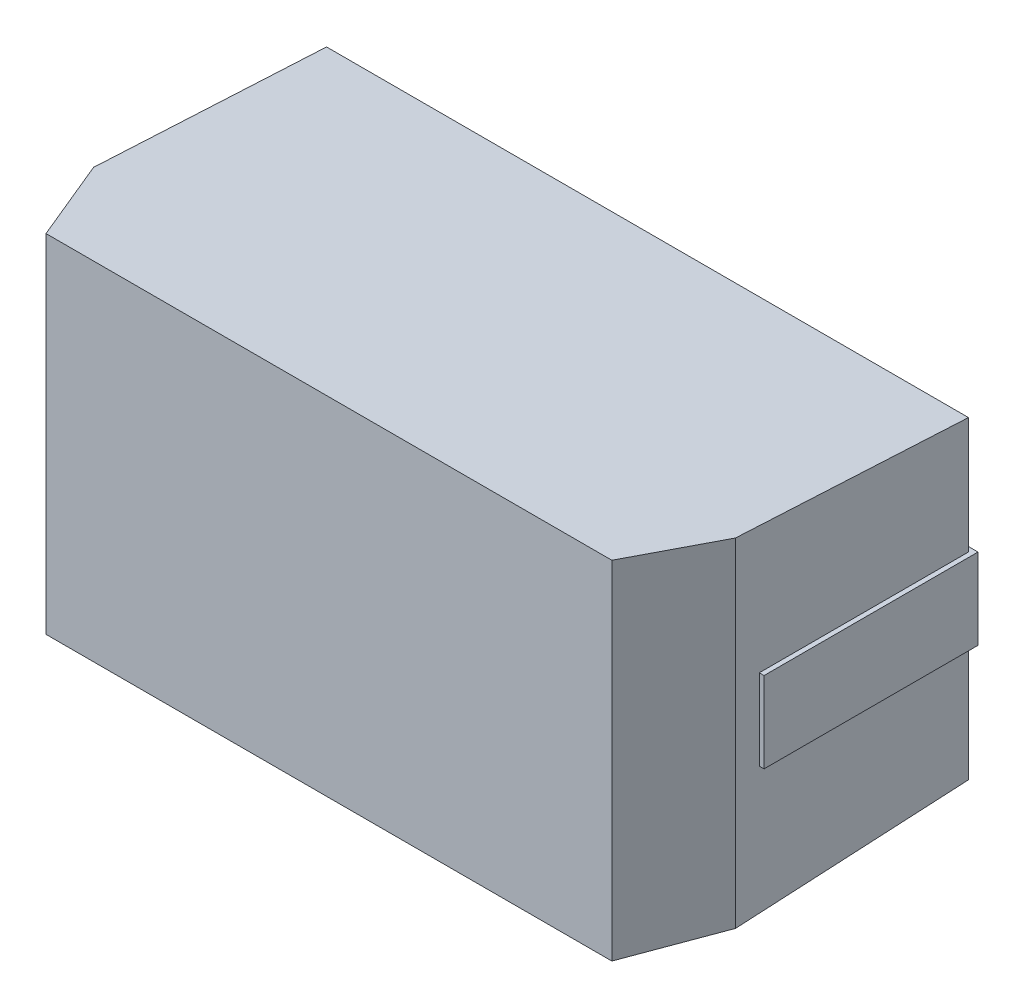
ISO-10303-21;
HEADER;
FILE_DESCRIPTION(('STEP AP214'),'2;1');
FILE_NAME('part.step','',(''),(''),'','','');
FILE_SCHEMA(('AUTOMOTIVE_DESIGN { 1 0 10303 214 1 1 1 1 }'));
ENDSEC;
DATA;
#1=APPLICATION_CONTEXT('core data for automotive mechanical design processes');
#2=APPLICATION_PROTOCOL_DEFINITION('international standard','automotive_design',2000,#1);
#3=PRODUCT_CONTEXT('',#1,'mechanical');
#4=PRODUCT('Part','Part','',(#3));
#5=PRODUCT_RELATED_PRODUCT_CATEGORY('part','',(#4));
#6=PRODUCT_DEFINITION_FORMATION('','',#4);
#7=PRODUCT_DEFINITION_CONTEXT('part definition',#1,'design');
#8=PRODUCT_DEFINITION('design','',#6,#7);
#9=PRODUCT_DEFINITION_SHAPE('','',#8);
#10=(LENGTH_UNIT() NAMED_UNIT(*) SI_UNIT(.MILLI.,.METRE.));
#11=(NAMED_UNIT(*) PLANE_ANGLE_UNIT() SI_UNIT($,.RADIAN.));
#12=(NAMED_UNIT(*) SI_UNIT($,.STERADIAN.) SOLID_ANGLE_UNIT());
#13=UNCERTAINTY_MEASURE_WITH_UNIT(LENGTH_MEASURE(1.E-05),#10,'distance_accuracy_value','');
#14=(GEOMETRIC_REPRESENTATION_CONTEXT(3) GLOBAL_UNCERTAINTY_ASSIGNED_CONTEXT((#13)) GLOBAL_UNIT_ASSIGNED_CONTEXT((#10,
#11,#12)) REPRESENTATION_CONTEXT('',''));
#15=CARTESIAN_POINT('',(0.,0.,0.));
#16=DIRECTION('',(0.,0.,1.));
#17=DIRECTION('',(1.,0.,0.));
#18=AXIS2_PLACEMENT_3D('',#15,#16,#17);
#19=CARTESIAN_POINT('',(6.75,3.65,28.9473124683118));
#20=DIRECTION('',(-1.,0.,0.));
#21=DIRECTION('',(0.,-1.,0.));
#22=AXIS2_PLACEMENT_3D('',#19,#20,#21);
#23=PLANE('',#22);
#24=DIRECTION('',(0.,-1.,0.));
#25=VECTOR('',#24,1.);
#26=CARTESIAN_POINT('',(6.75,0.85,4.5));
#27=LINE('',#26,#25);
#28=CARTESIAN_POINT('',(6.75,0.85,4.5));
#29=VERTEX_POINT('',#28);
#30=CARTESIAN_POINT('',(6.75,-0.85,4.5));
#31=VERTEX_POINT('',#30);
#32=EDGE_CURVE('E229',#29,#31,#27,.T.);
#33=ORIENTED_EDGE('',*,*,#32,.F.);
#34=DIRECTION('',(0.,0.,1.));
#35=VECTOR('',#34,1.);
#36=CARTESIAN_POINT('',(6.75,0.85,0.1));
#37=LINE('',#36,#35);
#38=CARTESIAN_POINT('',(6.75,0.850000000000001,0.1));
#39=VERTEX_POINT('',#38);
#40=EDGE_CURVE('E194',#39,#29,#37,.T.);
#41=ORIENTED_EDGE('',*,*,#40,.F.);
#42=DIRECTION('',(0.,1.,0.));
#43=VECTOR('',#42,1.);
#44=CARTESIAN_POINT('',(6.75,3.65,0.1));
#45=LINE('',#44,#43);
#46=CARTESIAN_POINT('',(6.75,3.29886787880362,0.1));
#47=VERTEX_POINT('',#46);
#48=EDGE_CURVE('E243',#39,#47,#45,.T.);
#49=ORIENTED_EDGE('',*,*,#48,.T.);
#50=DIRECTION('',(0.,0.052335956242944,0.998629534754574));
#51=VECTOR('',#50,1.);
#52=CARTESIAN_POINT('',(6.75,3.65,6.8));
#53=LINE('',#52,#51);
#54=CARTESIAN_POINT('',(6.75,3.55566599729053,4.99999999999999));
#55=VERTEX_POINT('',#54);
#56=EDGE_CURVE('E242',#55,#47,#53,.F.);
#57=ORIENTED_EDGE('',*,*,#56,.F.);
#58=DIRECTION('',(0.,-1.,0.));
#59=VECTOR('',#58,1.);
#60=CARTESIAN_POINT('',(6.75,-3.65,4.99999999999999));
#61=LINE('',#60,#59);
#62=CARTESIAN_POINT('',(6.75,-3.55566599729053,4.99999999999999));
#63=VERTEX_POINT('',#62);
#64=EDGE_CURVE('E12',#55,#63,#61,.T.);
#65=ORIENTED_EDGE('',*,*,#64,.T.);
#66=DIRECTION('',(0.,-0.052335956242944,0.998629534754574));
#67=VECTOR('',#66,1.);
#68=CARTESIAN_POINT('',(6.75,-4.78751718700479,28.5051209298784));
#69=LINE('',#68,#67);
#70=CARTESIAN_POINT('',(6.75,-3.29886787880362,0.1));
#71=VERTEX_POINT('',#70);
#72=EDGE_CURVE('E235',#63,#71,#69,.F.);
#73=ORIENTED_EDGE('',*,*,#72,.T.);
#74=CARTESIAN_POINT('',(6.75,-0.849999999999998,0.1));
#75=VERTEX_POINT('',#74);
#76=EDGE_CURVE('E239',#71,#75,#45,.T.);
#77=ORIENTED_EDGE('',*,*,#76,.T.);
#78=DIRECTION('',(0.,0.,1.));
#79=VECTOR('',#78,1.);
#80=CARTESIAN_POINT('',(6.75,-0.85,0.1));
#81=LINE('',#80,#79);
#82=EDGE_CURVE('E211',#75,#31,#81,.T.);
#83=ORIENTED_EDGE('',*,*,#82,.T.);
#84=EDGE_LOOP('',(#33,#41,#49,#57,#65,#73,#77,#83));
#85=FACE_BOUND('',#84,.T.);
#86=ADVANCED_FACE('F38',(#85),#23,.F.);
#87=CARTESIAN_POINT('',(-6.75,3.65,6.8));
#88=DIRECTION('',(0.,0.998629534754574,-0.0523359562429439));
#89=DIRECTION('',(0.,0.052335956242944,0.998629534754574));
#90=AXIS2_PLACEMENT_3D('',#87,#88,#89);
#91=PLANE('',#90);
#92=DIRECTION('',(0.,0.052335956242944,0.998629534754574));
#93=VECTOR('',#92,1.);
#94=CARTESIAN_POINT('',(-6.75,4.80751226891059,28.8866498208054));
#95=LINE('',#94,#93);
#96=CARTESIAN_POINT('',(-6.75,3.55566599729053,4.99999999999998));
#97=VERTEX_POINT('',#96);
#98=CARTESIAN_POINT('',(-6.75,3.29886787880362,0.1));
#99=VERTEX_POINT('',#98);
#100=EDGE_CURVE('E260',#97,#99,#95,.F.);
#101=ORIENTED_EDGE('',*,*,#100,.F.);
#102=DIRECTION('',(-0.405673519898112,-0.0478360086565384,-0.912765419770758));
#103=VECTOR('',#102,1.);
#104=CARTESIAN_POINT('',(-6.02083117733495,3.64164776440671,6.64062985099637));
#105=LINE('',#104,#103);
#106=CARTESIAN_POINT('',(-5.95,3.65,6.8));
#107=VERTEX_POINT('',#106);
#108=EDGE_CURVE('E48',#97,#107,#105,.F.);
#109=ORIENTED_EDGE('',*,*,#108,.T.);
#110=DIRECTION('',(-1.,0.,0.));
#111=VECTOR('',#110,1.);
#112=CARTESIAN_POINT('',(-6.75,3.65,6.8));
#113=LINE('',#112,#111);
#114=CARTESIAN_POINT('',(5.95,3.65,6.8));
#115=VERTEX_POINT('',#114);
#116=EDGE_CURVE('E244',#115,#107,#113,.T.);
#117=ORIENTED_EDGE('',*,*,#116,.F.);
#118=DIRECTION('',(-0.405673519898112,0.0478360086565384,0.912765419770758));
#119=VECTOR('',#118,1.);
#120=CARTESIAN_POINT('',(6.02083117733494,3.64164776440671,6.64062985099637));
#121=LINE('',#120,#119);
#122=EDGE_CURVE('E258',#115,#55,#121,.F.);
#123=ORIENTED_EDGE('',*,*,#122,.T.);
#124=ORIENTED_EDGE('',*,*,#56,.T.);
#125=DIRECTION('',(1.,0.,0.));
#126=VECTOR('',#125,1.);
#127=CARTESIAN_POINT('',(-6.75,3.29886787880362,0.1));
#128=LINE('',#127,#126);
#129=EDGE_CURVE('E262',#47,#99,#128,.F.);
#130=ORIENTED_EDGE('',*,*,#129,.T.);
#131=EDGE_LOOP('',(#101,#109,#117,#123,#124,#130));
#132=FACE_BOUND('',#131,.T.);
#133=ADVANCED_FACE('F323',(#132),#91,.T.);
#134=CARTESIAN_POINT('',(-6.75,3.65,28.9473124683118));
#135=DIRECTION('',(1.,0.,0.));
#136=DIRECTION('',(0.,1.,0.));
#137=AXIS2_PLACEMENT_3D('',#134,#135,#136);
#138=PLANE('',#137);
#139=DIRECTION('',(0.,-1.,0.));
#140=VECTOR('',#139,1.);
#141=CARTESIAN_POINT('',(-6.75,3.65,0.1));
#142=LINE('',#141,#140);
#143=CARTESIAN_POINT('',(-6.75,0.850000000000001,0.1));
#144=VERTEX_POINT('',#143);
#145=EDGE_CURVE('E236',#99,#144,#142,.T.);
#146=ORIENTED_EDGE('',*,*,#145,.T.);
#147=DIRECTION('',(0.,0.,1.));
#148=VECTOR('',#147,1.);
#149=CARTESIAN_POINT('',(-6.75,0.85,0.1));
#150=LINE('',#149,#148);
#151=CARTESIAN_POINT('',(-6.75,0.85,4.5));
#152=VERTEX_POINT('',#151);
#153=EDGE_CURVE('E57',#144,#152,#150,.T.);
#154=ORIENTED_EDGE('',*,*,#153,.T.);
#155=DIRECTION('',(0.,-1.,0.));
#156=VECTOR('',#155,1.);
#157=CARTESIAN_POINT('',(-6.75,0.85,4.5));
#158=LINE('',#157,#156);
#159=CARTESIAN_POINT('',(-6.75,-0.85,4.5));
#160=VERTEX_POINT('',#159);
#161=EDGE_CURVE('E142',#152,#160,#158,.T.);
#162=ORIENTED_EDGE('',*,*,#161,.T.);
#163=DIRECTION('',(0.,0.,1.));
#164=VECTOR('',#163,1.);
#165=CARTESIAN_POINT('',(-6.75,-0.85,0.1));
#166=LINE('',#165,#164);
#167=CARTESIAN_POINT('',(-6.75,-0.85,0.1));
#168=VERTEX_POINT('',#167);
#169=EDGE_CURVE('E174',#168,#160,#166,.T.);
#170=ORIENTED_EDGE('',*,*,#169,.F.);
#171=CARTESIAN_POINT('',(-6.75,-3.29886787880362,0.1));
#172=VERTEX_POINT('',#171);
#173=EDGE_CURVE('E87',#168,#172,#142,.T.);
#174=ORIENTED_EDGE('',*,*,#173,.T.);
#175=DIRECTION('',(0.,-0.052335956242944,0.998629534754574));
#176=VECTOR('',#175,1.);
#177=CARTESIAN_POINT('',(-6.75,-3.65,6.8));
#178=LINE('',#177,#176);
#179=CARTESIAN_POINT('',(-6.75,-3.55566599729053,4.99999999999998));
#180=VERTEX_POINT('',#179);
#181=EDGE_CURVE('E238',#180,#172,#178,.F.);
#182=ORIENTED_EDGE('',*,*,#181,.F.);
#183=DIRECTION('',(0.,1.,0.));
#184=VECTOR('',#183,1.);
#185=CARTESIAN_POINT('',(-6.75,3.65,4.99999999999998));
#186=LINE('',#185,#184);
#187=EDGE_CURVE('E257',#180,#97,#186,.T.);
#188=ORIENTED_EDGE('',*,*,#187,.T.);
#189=ORIENTED_EDGE('',*,*,#100,.T.);
#190=EDGE_LOOP('',(#146,#154,#162,#170,#174,#182,#188,#189));
#191=FACE_BOUND('',#190,.T.);
#192=ADVANCED_FACE('F333',(#191),#138,.F.);
#193=CARTESIAN_POINT('',(-6.75,-3.65,6.8));
#194=DIRECTION('',(0.,-0.998629534754574,-0.0523359562429439));
#195=DIRECTION('',(0.,0.052335956242944,-0.998629534754574));
#196=AXIS2_PLACEMENT_3D('',#193,#194,#195);
#197=PLANE('',#196);
#198=DIRECTION('',(1.,0.,0.));
#199=VECTOR('',#198,1.);
#200=CARTESIAN_POINT('',(-6.75,-3.65,6.8));
#201=LINE('',#200,#199);
#202=CARTESIAN_POINT('',(-5.95,-3.65,6.8));
#203=VERTEX_POINT('',#202);
#204=CARTESIAN_POINT('',(5.95,-3.65,6.8));
#205=VERTEX_POINT('',#204);
#206=EDGE_CURVE('E248',#203,#205,#201,.T.);
#207=ORIENTED_EDGE('',*,*,#206,.F.);
#208=DIRECTION('',(0.405673519898112,-0.0478360086565384,0.912765419770758));
#209=VECTOR('',#208,1.);
#210=CARTESIAN_POINT('',(-6.02083117733494,-3.64164776440671,6.64062985099637));
#211=LINE('',#210,#209);
#212=EDGE_CURVE('E42',#203,#180,#211,.F.);
#213=ORIENTED_EDGE('',*,*,#212,.T.);
#214=ORIENTED_EDGE('',*,*,#181,.T.);
#215=DIRECTION('',(-1.,0.,0.));
#216=VECTOR('',#215,1.);
#217=CARTESIAN_POINT('',(-6.75,-3.29886787880362,0.1));
#218=LINE('',#217,#216);
#219=EDGE_CURVE('E251',#172,#71,#218,.F.);
#220=ORIENTED_EDGE('',*,*,#219,.T.);
#221=ORIENTED_EDGE('',*,*,#72,.F.);
#222=DIRECTION('',(0.405673519898112,0.0478360086565384,-0.912765419770758));
#223=VECTOR('',#222,1.);
#224=CARTESIAN_POINT('',(6.02083117733495,-3.64164776440671,6.64062985099637));
#225=LINE('',#224,#223);
#226=EDGE_CURVE('E256',#63,#205,#225,.F.);
#227=ORIENTED_EDGE('',*,*,#226,.T.);
#228=EDGE_LOOP('',(#207,#213,#214,#220,#221,#227));
#229=FACE_BOUND('',#228,.T.);
#230=ADVANCED_FACE('F40',(#229),#197,.T.);
#231=CARTESIAN_POINT('',(0.,0.,0.1));
#232=DIRECTION('',(0.,0.,1.));
#233=DIRECTION('',(1.,0.,0.));
#234=AXIS2_PLACEMENT_3D('',#231,#232,#233);
#235=PLANE('',#234);
#236=DIRECTION('',(0.,-1.,0.));
#237=VECTOR('',#236,1.);
#238=CARTESIAN_POINT('',(-4.35,0.85,0.1));
#239=LINE('',#238,#237);
#240=CARTESIAN_POINT('',(-4.35,0.85,0.1));
#241=VERTEX_POINT('',#240);
#242=CARTESIAN_POINT('',(-4.35,-0.85,0.1));
#243=VERTEX_POINT('',#242);
#244=EDGE_CURVE('E131',#241,#243,#239,.T.);
#245=ORIENTED_EDGE('',*,*,#244,.F.);
#246=DIRECTION('',(-1.,0.,0.));
#247=VECTOR('',#246,1.);
#248=CARTESIAN_POINT('',(-4.35,0.85,0.1));
#249=LINE('',#248,#247);
#250=EDGE_CURVE('E136',#241,#144,#249,.T.);
#251=ORIENTED_EDGE('',*,*,#250,.T.);
#252=ORIENTED_EDGE('',*,*,#145,.F.);
#253=ORIENTED_EDGE('',*,*,#129,.F.);
#254=ORIENTED_EDGE('',*,*,#48,.F.);
#255=DIRECTION('',(1.,0.,0.));
#256=VECTOR('',#255,1.);
#257=CARTESIAN_POINT('',(4.35,0.85,0.1));
#258=LINE('',#257,#256);
#259=CARTESIAN_POINT('',(4.35,0.85,0.1));
#260=VERTEX_POINT('',#259);
#261=EDGE_CURVE('E190',#260,#39,#258,.T.);
#262=ORIENTED_EDGE('',*,*,#261,.F.);
#263=DIRECTION('',(0.,-1.,0.));
#264=VECTOR('',#263,1.);
#265=CARTESIAN_POINT('',(4.35,0.85,0.1));
#266=LINE('',#265,#264);
#267=CARTESIAN_POINT('',(4.35,-0.85,0.1));
#268=VERTEX_POINT('',#267);
#269=EDGE_CURVE('E232',#260,#268,#266,.T.);
#270=ORIENTED_EDGE('',*,*,#269,.T.);
#271=DIRECTION('',(1.,0.,0.));
#272=VECTOR('',#271,1.);
#273=CARTESIAN_POINT('',(4.35,-0.85,0.1));
#274=LINE('',#273,#272);
#275=EDGE_CURVE('E209',#268,#75,#274,.T.);
#276=ORIENTED_EDGE('',*,*,#275,.T.);
#277=ORIENTED_EDGE('',*,*,#76,.F.);
#278=ORIENTED_EDGE('',*,*,#219,.F.);
#279=ORIENTED_EDGE('',*,*,#173,.F.);
#280=DIRECTION('',(-1.,0.,0.));
#281=VECTOR('',#280,1.);
#282=CARTESIAN_POINT('',(-4.35,-0.85,0.1));
#283=LINE('',#282,#281);
#284=EDGE_CURVE('E138',#243,#168,#283,.T.);
#285=ORIENTED_EDGE('',*,*,#284,.F.);
#286=EDGE_LOOP('',(#245,#251,#252,#253,#254,#262,#270,#276,#277,#278,#279,#285));
#287=FACE_BOUND('',#286,.T.);
#288=ADVANCED_FACE('F133',(#287),#235,.F.);
#289=CARTESIAN_POINT('',(0.,0.,6.8));
#290=DIRECTION('',(0.,0.,1.));
#291=DIRECTION('',(1.,0.,0.));
#292=AXIS2_PLACEMENT_3D('',#289,#290,#291);
#293=PLANE('',#292);
#294=ORIENTED_EDGE('',*,*,#116,.T.);
#295=DIRECTION('',(0.,-1.,0.));
#296=VECTOR('',#295,1.);
#297=CARTESIAN_POINT('',(-5.95,-3.65,6.8));
#298=LINE('',#297,#296);
#299=EDGE_CURVE('E254',#107,#203,#298,.T.);
#300=ORIENTED_EDGE('',*,*,#299,.T.);
#301=ORIENTED_EDGE('',*,*,#206,.T.);
#302=DIRECTION('',(0.,1.,0.));
#303=VECTOR('',#302,1.);
#304=CARTESIAN_POINT('',(5.95,3.65,6.8));
#305=LINE('',#304,#303);
#306=EDGE_CURVE('E247',#205,#115,#305,.T.);
#307=ORIENTED_EDGE('',*,*,#306,.T.);
#308=EDGE_LOOP('',(#294,#300,#301,#307));
#309=FACE_BOUND('',#308,.T.);
#310=ADVANCED_FACE('F330',(#309),#293,.T.);
#311=CARTESIAN_POINT('',(-5.95,0.,6.8));
#312=DIRECTION('',(-0.913811548620258,0.,0.406138466053446));
#313=DIRECTION('',(0.,1.,0.));
#314=AXIS2_PLACEMENT_3D('',#311,#312,#313);
#315=PLANE('',#314);
#316=ORIENTED_EDGE('',*,*,#108,.F.);
#317=ORIENTED_EDGE('',*,*,#187,.F.);
#318=ORIENTED_EDGE('',*,*,#212,.F.);
#319=ORIENTED_EDGE('',*,*,#299,.F.);
#320=EDGE_LOOP('',(#316,#317,#318,#319));
#321=FACE_BOUND('',#320,.T.);
#322=ADVANCED_FACE('F332',(#321),#315,.T.);
#323=CARTESIAN_POINT('',(5.95,0.,6.8));
#324=DIRECTION('',(0.913811548620258,0.,0.406138466053446));
#325=DIRECTION('',(0.,-1.,0.));
#326=AXIS2_PLACEMENT_3D('',#323,#324,#325);
#327=PLANE('',#326);
#328=ORIENTED_EDGE('',*,*,#226,.F.);
#329=ORIENTED_EDGE('',*,*,#64,.F.);
#330=ORIENTED_EDGE('',*,*,#122,.F.);
#331=ORIENTED_EDGE('',*,*,#306,.F.);
#332=EDGE_LOOP('',(#328,#329,#330,#331));
#333=FACE_BOUND('',#332,.T.);
#334=ADVANCED_FACE('F328',(#333),#327,.T.);
#335=CARTESIAN_POINT('',(4.35,0.85,0.));
#336=DIRECTION('',(1.,0.,0.));
#337=DIRECTION('',(0.,0.,-1.));
#338=AXIS2_PLACEMENT_3D('',#335,#336,#337);
#339=PLANE('',#338);
#340=DIRECTION('',(0.,0.,1.));
#341=VECTOR('',#340,1.);
#342=CARTESIAN_POINT('',(4.35,-0.85,0.));
#343=LINE('',#342,#341);
#344=CARTESIAN_POINT('',(4.35,-0.85,0.));
#345=VERTEX_POINT('',#344);
#346=EDGE_CURVE('E186',#345,#268,#343,.T.);
#347=ORIENTED_EDGE('',*,*,#346,.T.);
#348=ORIENTED_EDGE('',*,*,#269,.F.);
#349=DIRECTION('',(0.,0.,1.));
#350=VECTOR('',#349,1.);
#351=CARTESIAN_POINT('',(4.35,0.85,0.));
#352=LINE('',#351,#350);
#353=CARTESIAN_POINT('',(4.35,0.85,0.));
#354=VERTEX_POINT('',#353);
#355=EDGE_CURVE('E187',#354,#260,#352,.T.);
#356=ORIENTED_EDGE('',*,*,#355,.F.);
#357=DIRECTION('',(0.,-1.,0.));
#358=VECTOR('',#357,1.);
#359=CARTESIAN_POINT('',(4.35,0.85,0.));
#360=LINE('',#359,#358);
#361=EDGE_CURVE('E206',#354,#345,#360,.T.);
#362=ORIENTED_EDGE('',*,*,#361,.T.);
#363=EDGE_LOOP('',(#347,#348,#356,#362));
#364=FACE_BOUND('',#363,.T.);
#365=ADVANCED_FACE('F315',(#364),#339,.F.);
#366=CARTESIAN_POINT('',(6.75,0.85,4.5));
#367=DIRECTION('',(0.,0.,-1.));
#368=DIRECTION('',(-1.,0.,0.));
#369=AXIS2_PLACEMENT_3D('',#366,#367,#368);
#370=PLANE('',#369);
#371=DIRECTION('',(1.,0.,0.));
#372=VECTOR('',#371,1.);
#373=CARTESIAN_POINT('',(6.75,-0.85,4.5));
#374=LINE('',#373,#372);
#375=CARTESIAN_POINT('',(6.85,-0.85,4.5));
#376=VERTEX_POINT('',#375);
#377=EDGE_CURVE('E213',#31,#376,#374,.T.);
#378=ORIENTED_EDGE('',*,*,#377,.T.);
#379=DIRECTION('',(0.,-1.,0.));
#380=VECTOR('',#379,1.);
#381=CARTESIAN_POINT('',(6.85,0.85,4.5));
#382=LINE('',#381,#380);
#383=CARTESIAN_POINT('',(6.85,0.85,4.5));
#384=VERTEX_POINT('',#383);
#385=EDGE_CURVE('E226',#384,#376,#382,.T.);
#386=ORIENTED_EDGE('',*,*,#385,.F.);
#387=DIRECTION('',(1.,0.,0.));
#388=VECTOR('',#387,1.);
#389=CARTESIAN_POINT('',(6.75,0.85,4.5));
#390=LINE('',#389,#388);
#391=EDGE_CURVE('E197',#29,#384,#390,.T.);
#392=ORIENTED_EDGE('',*,*,#391,.F.);
#393=ORIENTED_EDGE('',*,*,#32,.T.);
#394=EDGE_LOOP('',(#378,#386,#392,#393));
#395=FACE_BOUND('',#394,.T.);
#396=ADVANCED_FACE('F291',(#395),#370,.F.);
#397=CARTESIAN_POINT('',(6.85,0.85,4.5));
#398=DIRECTION('',(-1.,0.,0.));
#399=DIRECTION('',(0.,0.,1.));
#400=AXIS2_PLACEMENT_3D('',#397,#398,#399);
#401=PLANE('',#400);
#402=DIRECTION('',(0.,0.,-1.));
#403=VECTOR('',#402,1.);
#404=CARTESIAN_POINT('',(6.85,-0.85,4.5));
#405=LINE('',#404,#403);
#406=CARTESIAN_POINT('',(6.85,-0.85,0.));
#407=VERTEX_POINT('',#406);
#408=EDGE_CURVE('E216',#376,#407,#405,.T.);
#409=ORIENTED_EDGE('',*,*,#408,.T.);
#410=DIRECTION('',(0.,-1.,0.));
#411=VECTOR('',#410,1.);
#412=CARTESIAN_POINT('',(6.85,0.85,0.));
#413=LINE('',#412,#411);
#414=CARTESIAN_POINT('',(6.85,0.85,0.));
#415=VERTEX_POINT('',#414);
#416=EDGE_CURVE('E223',#415,#407,#413,.T.);
#417=ORIENTED_EDGE('',*,*,#416,.F.);
#418=DIRECTION('',(0.,0.,-1.));
#419=VECTOR('',#418,1.);
#420=CARTESIAN_POINT('',(6.85,0.85,4.5));
#421=LINE('',#420,#419);
#422=EDGE_CURVE('E200',#384,#415,#421,.T.);
#423=ORIENTED_EDGE('',*,*,#422,.F.);
#424=ORIENTED_EDGE('',*,*,#385,.T.);
#425=EDGE_LOOP('',(#409,#417,#423,#424));
#426=FACE_BOUND('',#425,.T.);
#427=ADVANCED_FACE('F298',(#426),#401,.F.);
#428=CARTESIAN_POINT('',(6.85,0.85,0.));
#429=DIRECTION('',(0.,0.,1.));
#430=DIRECTION('',(1.,0.,0.));
#431=AXIS2_PLACEMENT_3D('',#428,#429,#430);
#432=PLANE('',#431);
#433=DIRECTION('',(-1.,0.,0.));
#434=VECTOR('',#433,1.);
#435=CARTESIAN_POINT('',(6.85,-0.85,0.));
#436=LINE('',#435,#434);
#437=EDGE_CURVE('E191',#407,#345,#436,.T.);
#438=ORIENTED_EDGE('',*,*,#437,.T.);
#439=ORIENTED_EDGE('',*,*,#361,.F.);
#440=DIRECTION('',(-1.,0.,0.));
#441=VECTOR('',#440,1.);
#442=CARTESIAN_POINT('',(6.85,0.85,0.));
#443=LINE('',#442,#441);
#444=EDGE_CURVE('E203',#415,#354,#443,.T.);
#445=ORIENTED_EDGE('',*,*,#444,.F.);
#446=ORIENTED_EDGE('',*,*,#416,.T.);
#447=EDGE_LOOP('',(#438,#439,#445,#446));
#448=FACE_BOUND('',#447,.T.);
#449=ADVANCED_FACE('F312',(#448),#432,.F.);
#450=CARTESIAN_POINT('',(0.,0.85,0.));
#451=DIRECTION('',(0.,1.,0.));
#452=DIRECTION('',(0.,0.,1.));
#453=AXIS2_PLACEMENT_3D('',#450,#451,#452);
#454=PLANE('',#453);
#455=ORIENTED_EDGE('',*,*,#355,.T.);
#456=ORIENTED_EDGE('',*,*,#261,.T.);
#457=ORIENTED_EDGE('',*,*,#40,.T.);
#458=ORIENTED_EDGE('',*,*,#391,.T.);
#459=ORIENTED_EDGE('',*,*,#422,.T.);
#460=ORIENTED_EDGE('',*,*,#444,.T.);
#461=EDGE_LOOP('',(#455,#456,#457,#458,#459,#460));
#462=FACE_BOUND('',#461,.T.);
#463=ADVANCED_FACE('F304',(#462),#454,.T.);
#464=CARTESIAN_POINT('',(0.,-0.85,0.));
#465=DIRECTION('',(0.,1.,0.));
#466=DIRECTION('',(0.,0.,1.));
#467=AXIS2_PLACEMENT_3D('',#464,#465,#466);
#468=PLANE('',#467);
#469=ORIENTED_EDGE('',*,*,#346,.F.);
#470=ORIENTED_EDGE('',*,*,#437,.F.);
#471=ORIENTED_EDGE('',*,*,#408,.F.);
#472=ORIENTED_EDGE('',*,*,#377,.F.);
#473=ORIENTED_EDGE('',*,*,#82,.F.);
#474=ORIENTED_EDGE('',*,*,#275,.F.);
#475=EDGE_LOOP('',(#469,#470,#471,#472,#473,#474));
#476=FACE_BOUND('',#475,.T.);
#477=ADVANCED_FACE('F284',(#476),#468,.F.);
#478=CARTESIAN_POINT('',(-4.35,0.85,0.));
#479=DIRECTION('',(1.,0.,0.));
#480=DIRECTION('',(0.,0.,-1.));
#481=AXIS2_PLACEMENT_3D('',#478,#479,#480);
#482=PLANE('',#481);
#483=DIRECTION('',(0.,0.,1.));
#484=VECTOR('',#483,1.);
#485=CARTESIAN_POINT('',(-4.35,-0.85,0.));
#486=LINE('',#485,#484);
#487=CARTESIAN_POINT('',(-4.35,-0.85,0.));
#488=VERTEX_POINT('',#487);
#489=EDGE_CURVE('E163',#488,#243,#486,.T.);
#490=ORIENTED_EDGE('',*,*,#489,.F.);
#491=DIRECTION('',(0.,-1.,0.));
#492=VECTOR('',#491,1.);
#493=CARTESIAN_POINT('',(-4.35,0.85,0.));
#494=LINE('',#493,#492);
#495=CARTESIAN_POINT('',(-4.35,0.85,0.));
#496=VERTEX_POINT('',#495);
#497=EDGE_CURVE('E150',#496,#488,#494,.T.);
#498=ORIENTED_EDGE('',*,*,#497,.F.);
#499=DIRECTION('',(0.,0.,1.));
#500=VECTOR('',#499,1.);
#501=CARTESIAN_POINT('',(-4.35,0.85,0.));
#502=LINE('',#501,#500);
#503=EDGE_CURVE('E146',#496,#241,#502,.T.);
#504=ORIENTED_EDGE('',*,*,#503,.T.);
#505=ORIENTED_EDGE('',*,*,#244,.T.);
#506=EDGE_LOOP('',(#490,#498,#504,#505));
#507=FACE_BOUND('',#506,.T.);
#508=ADVANCED_FACE('F147',(#507),#482,.T.);
#509=CARTESIAN_POINT('',(-6.85,0.85,0.));
#510=DIRECTION('',(0.,0.,-1.));
#511=DIRECTION('',(-1.,0.,0.));
#512=AXIS2_PLACEMENT_3D('',#509,#510,#511);
#513=PLANE('',#512);
#514=DIRECTION('',(1.,0.,0.));
#515=VECTOR('',#514,1.);
#516=CARTESIAN_POINT('',(-6.85,-0.85,0.));
#517=LINE('',#516,#515);
#518=CARTESIAN_POINT('',(-6.85,-0.85,0.));
#519=VERTEX_POINT('',#518);
#520=EDGE_CURVE('E165',#519,#488,#517,.T.);
#521=ORIENTED_EDGE('',*,*,#520,.F.);
#522=DIRECTION('',(0.,-1.,0.));
#523=VECTOR('',#522,1.);
#524=CARTESIAN_POINT('',(-6.85,0.85,0.));
#525=LINE('',#524,#523);
#526=CARTESIAN_POINT('',(-6.85,0.85,0.));
#527=VERTEX_POINT('',#526);
#528=EDGE_CURVE('E182',#527,#519,#525,.T.);
#529=ORIENTED_EDGE('',*,*,#528,.F.);
#530=DIRECTION('',(1.,0.,0.));
#531=VECTOR('',#530,1.);
#532=CARTESIAN_POINT('',(-6.85,0.85,0.));
#533=LINE('',#532,#531);
#534=EDGE_CURVE('E154',#527,#496,#533,.T.);
#535=ORIENTED_EDGE('',*,*,#534,.T.);
#536=ORIENTED_EDGE('',*,*,#497,.T.);
#537=EDGE_LOOP('',(#521,#529,#535,#536));
#538=FACE_BOUND('',#537,.T.);
#539=ADVANCED_FACE('F423',(#538),#513,.T.);
#540=CARTESIAN_POINT('',(-6.85,0.85,4.5));
#541=DIRECTION('',(-1.,0.,0.));
#542=DIRECTION('',(0.,0.,1.));
#543=AXIS2_PLACEMENT_3D('',#540,#541,#542);
#544=PLANE('',#543);
#545=DIRECTION('',(0.,0.,-1.));
#546=VECTOR('',#545,1.);
#547=CARTESIAN_POINT('',(-6.85,-0.85,4.5));
#548=LINE('',#547,#546);
#549=CARTESIAN_POINT('',(-6.85,-0.85,4.5));
#550=VERTEX_POINT('',#549);
#551=EDGE_CURVE('E168',#550,#519,#548,.T.);
#552=ORIENTED_EDGE('',*,*,#551,.F.);
#553=DIRECTION('',(0.,-1.,0.));
#554=VECTOR('',#553,1.);
#555=CARTESIAN_POINT('',(-6.85,0.85,4.5));
#556=LINE('',#555,#554);
#557=CARTESIAN_POINT('',(-6.85,0.85,4.5));
#558=VERTEX_POINT('',#557);
#559=EDGE_CURVE('E179',#558,#550,#556,.T.);
#560=ORIENTED_EDGE('',*,*,#559,.F.);
#561=DIRECTION('',(0.,0.,-1.));
#562=VECTOR('',#561,1.);
#563=CARTESIAN_POINT('',(-6.85,0.85,4.5));
#564=LINE('',#563,#562);
#565=EDGE_CURVE('E516',#558,#527,#564,.T.);
#566=ORIENTED_EDGE('',*,*,#565,.T.);
#567=ORIENTED_EDGE('',*,*,#528,.T.);
#568=EDGE_LOOP('',(#552,#560,#566,#567));
#569=FACE_BOUND('',#568,.T.);
#570=ADVANCED_FACE('F431',(#569),#544,.T.);
#571=CARTESIAN_POINT('',(-6.75,0.85,4.5));
#572=DIRECTION('',(0.,0.,1.));
#573=DIRECTION('',(1.,0.,0.));
#574=AXIS2_PLACEMENT_3D('',#571,#572,#573);
#575=PLANE('',#574);
#576=DIRECTION('',(-1.,0.,0.));
#577=VECTOR('',#576,1.);
#578=CARTESIAN_POINT('',(-6.75,-0.85,4.5));
#579=LINE('',#578,#577);
#580=EDGE_CURVE('E171',#160,#550,#579,.T.);
#581=ORIENTED_EDGE('',*,*,#580,.F.);
#582=ORIENTED_EDGE('',*,*,#161,.F.);
#583=DIRECTION('',(-1.,0.,0.));
#584=VECTOR('',#583,1.);
#585=CARTESIAN_POINT('',(-6.75,0.85,4.5));
#586=LINE('',#585,#584);
#587=EDGE_CURVE('E159',#152,#558,#586,.T.);
#588=ORIENTED_EDGE('',*,*,#587,.T.);
#589=ORIENTED_EDGE('',*,*,#559,.T.);
#590=EDGE_LOOP('',(#581,#582,#588,#589));
#591=FACE_BOUND('',#590,.T.);
#592=ADVANCED_FACE('F440',(#591),#575,.T.);
#593=CARTESIAN_POINT('',(0.,0.85,0.));
#594=DIRECTION('',(0.,1.,0.));
#595=DIRECTION('',(0.,0.,1.));
#596=AXIS2_PLACEMENT_3D('',#593,#594,#595);
#597=PLANE('',#596);
#598=ORIENTED_EDGE('',*,*,#503,.F.);
#599=ORIENTED_EDGE('',*,*,#534,.F.);
#600=ORIENTED_EDGE('',*,*,#565,.F.);
#601=ORIENTED_EDGE('',*,*,#587,.F.);
#602=ORIENTED_EDGE('',*,*,#153,.F.);
#603=ORIENTED_EDGE('',*,*,#250,.F.);
#604=EDGE_LOOP('',(#598,#599,#600,#601,#602,#603));
#605=FACE_BOUND('',#604,.T.);
#606=ADVANCED_FACE('F156',(#605),#597,.T.);
#607=CARTESIAN_POINT('',(0.,-0.85,0.));
#608=DIRECTION('',(0.,1.,0.));
#609=DIRECTION('',(0.,0.,1.));
#610=AXIS2_PLACEMENT_3D('',#607,#608,#609);
#611=PLANE('',#610);
#612=ORIENTED_EDGE('',*,*,#489,.T.);
#613=ORIENTED_EDGE('',*,*,#284,.T.);
#614=ORIENTED_EDGE('',*,*,#169,.T.);
#615=ORIENTED_EDGE('',*,*,#580,.T.);
#616=ORIENTED_EDGE('',*,*,#551,.T.);
#617=ORIENTED_EDGE('',*,*,#520,.T.);
#618=EDGE_LOOP('',(#612,#613,#614,#615,#616,#617));
#619=FACE_BOUND('',#618,.T.);
#620=ADVANCED_FACE('F457',(#619),#611,.F.);
#621=CLOSED_SHELL('',(#86,#133,#192,#230,#288,#310,#322,#334,#365,#396,#427,#449,#463,#477,#508,
#539,#570,#592,#606,#620));
#622=MANIFOLD_SOLID_BREP('B2',#621);
#623=ADVANCED_BREP_SHAPE_REPRESENTATION('',(#18,#622),#14);
#624=SHAPE_DEFINITION_REPRESENTATION(#9,#623);
ENDSEC;
END-ISO-10303-21;
